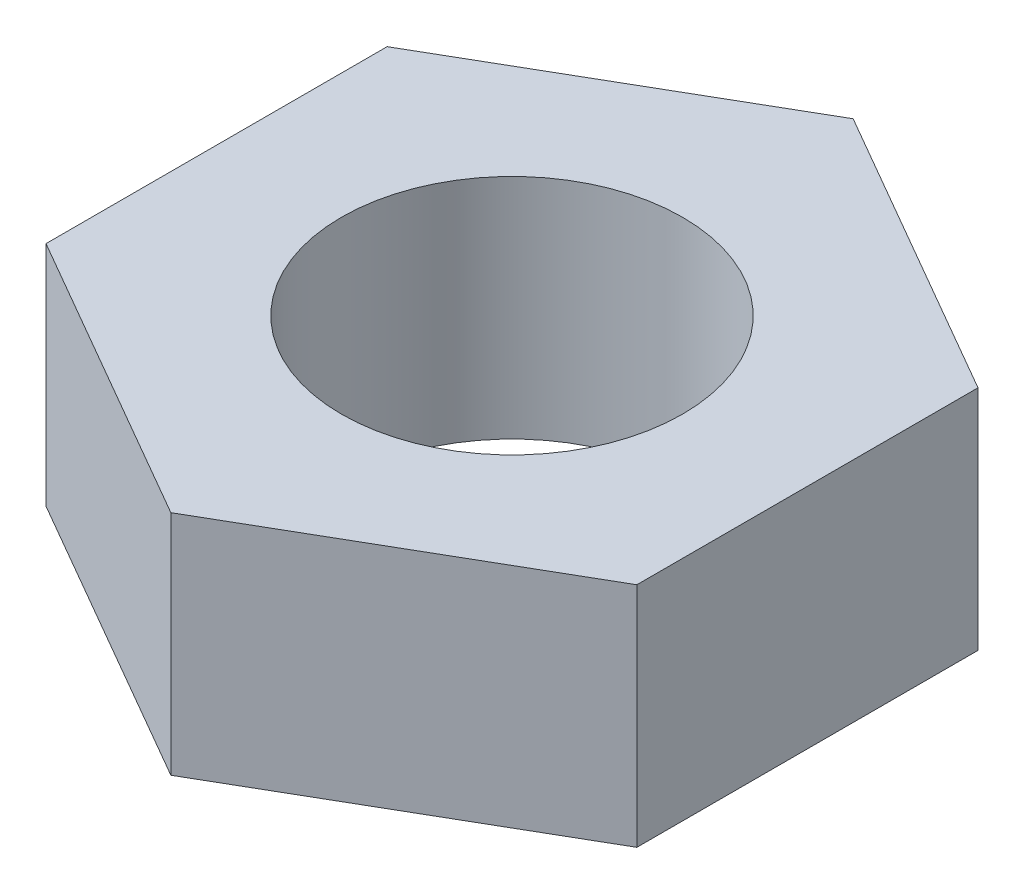
ISO-10303-21;
HEADER;
FILE_DESCRIPTION(('STEP AP214'),'2;1');
FILE_NAME('part.step','',(''),(''),'','','');
FILE_SCHEMA(('AUTOMOTIVE_DESIGN { 1 0 10303 214 1 1 1 1 }'));
ENDSEC;
DATA;
#1=APPLICATION_CONTEXT('core data for automotive mechanical design processes');
#2=APPLICATION_PROTOCOL_DEFINITION('international standard','automotive_design',2000,#1);
#3=PRODUCT_CONTEXT('',#1,'mechanical');
#4=PRODUCT('Part','Part','',(#3));
#5=PRODUCT_RELATED_PRODUCT_CATEGORY('part','',(#4));
#6=PRODUCT_DEFINITION_FORMATION('','',#4);
#7=PRODUCT_DEFINITION_CONTEXT('part definition',#1,'design');
#8=PRODUCT_DEFINITION('design','',#6,#7);
#9=PRODUCT_DEFINITION_SHAPE('','',#8);
#10=(LENGTH_UNIT() NAMED_UNIT(*) SI_UNIT(.MILLI.,.METRE.));
#11=(NAMED_UNIT(*) PLANE_ANGLE_UNIT() SI_UNIT($,.RADIAN.));
#12=(NAMED_UNIT(*) SI_UNIT($,.STERADIAN.) SOLID_ANGLE_UNIT());
#13=UNCERTAINTY_MEASURE_WITH_UNIT(LENGTH_MEASURE(1.E-05),#10,'distance_accuracy_value','');
#14=(GEOMETRIC_REPRESENTATION_CONTEXT(3) GLOBAL_UNCERTAINTY_ASSIGNED_CONTEXT((#13)) GLOBAL_UNIT_ASSIGNED_CONTEXT((#10,
#11,#12)) REPRESENTATION_CONTEXT('',''));
#15=CARTESIAN_POINT('',(0.,0.,0.));
#16=DIRECTION('',(0.,0.,1.));
#17=DIRECTION('',(1.,0.,0.));
#18=AXIS2_PLACEMENT_3D('',#15,#16,#17);
#19=CARTESIAN_POINT('',(-2.59807621135332,2.,-1.49999999999999));
#20=DIRECTION('',(1.,0.,0.));
#21=DIRECTION('',(0.,0.,-1.));
#22=AXIS2_PLACEMENT_3D('',#19,#20,#21);
#23=PLANE('',#22);
#24=DIRECTION('',(0.,0.,1.));
#25=VECTOR('',#24,1.);
#26=CARTESIAN_POINT('',(-2.59807621135332,0.,-1.49999999999999));
#27=LINE('',#26,#25);
#28=CARTESIAN_POINT('',(-2.59807621135332,0.,-1.49999999999999));
#29=VERTEX_POINT('',#28);
#30=CARTESIAN_POINT('',(-2.59807621135332,0.,1.49999999999999));
#31=VERTEX_POINT('',#30);
#32=EDGE_CURVE('E119',#29,#31,#27,.T.);
#33=ORIENTED_EDGE('',*,*,#32,.T.);
#34=DIRECTION('',(0.,-1.,0.));
#35=VECTOR('',#34,1.);
#36=CARTESIAN_POINT('',(-2.59807621135332,2.,1.49999999999999));
#37=LINE('',#36,#35);
#38=CARTESIAN_POINT('',(-2.59807621135332,2.,1.49999999999999));
#39=VERTEX_POINT('',#38);
#40=EDGE_CURVE('E11',#39,#31,#37,.T.);
#41=ORIENTED_EDGE('',*,*,#40,.F.);
#42=DIRECTION('',(0.,0.,1.));
#43=VECTOR('',#42,1.);
#44=CARTESIAN_POINT('',(-2.59807621135332,2.,-1.49999999999999));
#45=LINE('',#44,#43);
#46=CARTESIAN_POINT('',(-2.59807621135332,2.,-1.49999999999999));
#47=VERTEX_POINT('',#46);
#48=EDGE_CURVE('E129',#47,#39,#45,.T.);
#49=ORIENTED_EDGE('',*,*,#48,.F.);
#50=DIRECTION('',(0.,-1.,0.));
#51=VECTOR('',#50,1.);
#52=CARTESIAN_POINT('',(-2.59807621135332,2.,-1.49999999999999));
#53=LINE('',#52,#51);
#54=EDGE_CURVE('E115',#47,#29,#53,.T.);
#55=ORIENTED_EDGE('',*,*,#54,.T.);
#56=EDGE_LOOP('',(#33,#41,#49,#55));
#57=FACE_BOUND('',#56,.T.);
#58=ADVANCED_FACE('F34',(#57),#23,.F.);
#59=CARTESIAN_POINT('',(-2.59807621135332,2.,1.49999999999999));
#60=DIRECTION('',(0.500000000000001,0.,-0.866025403784438));
#61=DIRECTION('',(-0.866025403784438,0.,-0.500000000000001));
#62=AXIS2_PLACEMENT_3D('',#59,#60,#61);
#63=PLANE('',#62);
#64=DIRECTION('',(0.866025403784438,0.,0.500000000000001));
#65=VECTOR('',#64,1.);
#66=CARTESIAN_POINT('',(-2.59807621135332,0.,1.49999999999999));
#67=LINE('',#66,#65);
#68=CARTESIAN_POINT('',(0.,0.,3.));
#69=VERTEX_POINT('',#68);
#70=EDGE_CURVE('E122',#31,#69,#67,.T.);
#71=ORIENTED_EDGE('',*,*,#70,.T.);
#72=DIRECTION('',(0.,-1.,0.));
#73=VECTOR('',#72,1.);
#74=CARTESIAN_POINT('',(0.,2.,3.));
#75=LINE('',#74,#73);
#76=CARTESIAN_POINT('',(0.,2.,3.));
#77=VERTEX_POINT('',#76);
#78=EDGE_CURVE('E43',#77,#69,#75,.T.);
#79=ORIENTED_EDGE('',*,*,#78,.F.);
#80=DIRECTION('',(0.866025403784438,0.,0.500000000000001));
#81=VECTOR('',#80,1.);
#82=CARTESIAN_POINT('',(-2.59807621135332,2.,1.49999999999999));
#83=LINE('',#82,#81);
#84=EDGE_CURVE('E88',#39,#77,#83,.T.);
#85=ORIENTED_EDGE('',*,*,#84,.F.);
#86=ORIENTED_EDGE('',*,*,#40,.T.);
#87=EDGE_LOOP('',(#71,#79,#85,#86));
#88=FACE_BOUND('',#87,.T.);
#89=ADVANCED_FACE('F155',(#88),#63,.F.);
#90=CARTESIAN_POINT('',(0.,2.,3.));
#91=DIRECTION('',(-0.500000000000001,0.,-0.866025403784438));
#92=DIRECTION('',(-0.866025403784438,0.,0.500000000000001));
#93=AXIS2_PLACEMENT_3D('',#90,#91,#92);
#94=PLANE('',#93);
#95=DIRECTION('',(0.866025403784438,0.,-0.500000000000001));
#96=VECTOR('',#95,1.);
#97=CARTESIAN_POINT('',(0.,0.,3.));
#98=LINE('',#97,#96);
#99=CARTESIAN_POINT('',(2.59807621135332,0.,1.49999999999999));
#100=VERTEX_POINT('',#99);
#101=EDGE_CURVE('E124',#69,#100,#98,.T.);
#102=ORIENTED_EDGE('',*,*,#101,.T.);
#103=DIRECTION('',(0.,-1.,0.));
#104=VECTOR('',#103,1.);
#105=CARTESIAN_POINT('',(2.59807621135332,2.,1.49999999999999));
#106=LINE('',#105,#104);
#107=CARTESIAN_POINT('',(2.59807621135332,2.,1.49999999999999));
#108=VERTEX_POINT('',#107);
#109=EDGE_CURVE('E110',#108,#100,#106,.T.);
#110=ORIENTED_EDGE('',*,*,#109,.F.);
#111=DIRECTION('',(0.866025403784438,0.,-0.500000000000001));
#112=VECTOR('',#111,1.);
#113=CARTESIAN_POINT('',(0.,2.,3.));
#114=LINE('',#113,#112);
#115=EDGE_CURVE('E101',#77,#108,#114,.T.);
#116=ORIENTED_EDGE('',*,*,#115,.F.);
#117=ORIENTED_EDGE('',*,*,#78,.T.);
#118=EDGE_LOOP('',(#102,#110,#116,#117));
#119=FACE_BOUND('',#118,.T.);
#120=ADVANCED_FACE('F136',(#119),#94,.F.);
#121=CARTESIAN_POINT('',(2.59807621135332,2.,1.49999999999999));
#122=DIRECTION('',(-1.,0.,0.));
#123=DIRECTION('',(0.,0.,1.));
#124=AXIS2_PLACEMENT_3D('',#121,#122,#123);
#125=PLANE('',#124);
#126=DIRECTION('',(0.,0.,-1.));
#127=VECTOR('',#126,1.);
#128=CARTESIAN_POINT('',(2.59807621135332,0.,1.49999999999999));
#129=LINE('',#128,#127);
#130=CARTESIAN_POINT('',(2.59807621135332,0.,-1.49999999999999));
#131=VERTEX_POINT('',#130);
#132=EDGE_CURVE('E109',#100,#131,#129,.T.);
#133=ORIENTED_EDGE('',*,*,#132,.T.);
#134=DIRECTION('',(0.,-1.,0.));
#135=VECTOR('',#134,1.);
#136=CARTESIAN_POINT('',(2.59807621135332,2.,-1.49999999999999));
#137=LINE('',#136,#135);
#138=CARTESIAN_POINT('',(2.59807621135332,2.,-1.49999999999999));
#139=VERTEX_POINT('',#138);
#140=EDGE_CURVE('E106',#139,#131,#137,.T.);
#141=ORIENTED_EDGE('',*,*,#140,.F.);
#142=DIRECTION('',(0.,0.,-1.));
#143=VECTOR('',#142,1.);
#144=CARTESIAN_POINT('',(2.59807621135332,2.,1.49999999999999));
#145=LINE('',#144,#143);
#146=EDGE_CURVE('E95',#108,#139,#145,.T.);
#147=ORIENTED_EDGE('',*,*,#146,.F.);
#148=ORIENTED_EDGE('',*,*,#109,.T.);
#149=EDGE_LOOP('',(#133,#141,#147,#148));
#150=FACE_BOUND('',#149,.T.);
#151=ADVANCED_FACE('F107',(#150),#125,.F.);
#152=CARTESIAN_POINT('',(2.59807621135332,2.,-1.49999999999999));
#153=DIRECTION('',(-0.500000000000001,0.,0.866025403784438));
#154=DIRECTION('',(0.866025403784438,0.,0.500000000000001));
#155=AXIS2_PLACEMENT_3D('',#152,#153,#154);
#156=PLANE('',#155);
#157=DIRECTION('',(-0.866025403784438,0.,-0.500000000000001));
#158=VECTOR('',#157,1.);
#159=CARTESIAN_POINT('',(2.59807621135332,0.,-1.49999999999999));
#160=LINE('',#159,#158);
#161=CARTESIAN_POINT('',(0.,0.,-3.));
#162=VERTEX_POINT('',#161);
#163=EDGE_CURVE('E74',#131,#162,#160,.T.);
#164=ORIENTED_EDGE('',*,*,#163,.T.);
#165=DIRECTION('',(0.,-1.,0.));
#166=VECTOR('',#165,1.);
#167=CARTESIAN_POINT('',(0.,2.,-3.));
#168=LINE('',#167,#166);
#169=CARTESIAN_POINT('',(0.,2.,-3.));
#170=VERTEX_POINT('',#169);
#171=EDGE_CURVE('E111',#170,#162,#168,.T.);
#172=ORIENTED_EDGE('',*,*,#171,.F.);
#173=DIRECTION('',(-0.866025403784438,0.,-0.500000000000001));
#174=VECTOR('',#173,1.);
#175=CARTESIAN_POINT('',(2.59807621135332,2.,-1.49999999999999));
#176=LINE('',#175,#174);
#177=EDGE_CURVE('E99',#139,#170,#176,.T.);
#178=ORIENTED_EDGE('',*,*,#177,.F.);
#179=ORIENTED_EDGE('',*,*,#140,.T.);
#180=EDGE_LOOP('',(#164,#172,#178,#179));
#181=FACE_BOUND('',#180,.T.);
#182=ADVANCED_FACE('F113',(#181),#156,.F.);
#183=CARTESIAN_POINT('',(0.,2.,-3.));
#184=DIRECTION('',(0.500000000000001,0.,0.866025403784438));
#185=DIRECTION('',(0.866025403784438,0.,-0.500000000000001));
#186=AXIS2_PLACEMENT_3D('',#183,#184,#185);
#187=PLANE('',#186);
#188=DIRECTION('',(-0.866025403784438,0.,0.500000000000001));
#189=VECTOR('',#188,1.);
#190=CARTESIAN_POINT('',(0.,0.,-3.));
#191=LINE('',#190,#189);
#192=EDGE_CURVE('E80',#162,#29,#191,.T.);
#193=ORIENTED_EDGE('',*,*,#192,.T.);
#194=ORIENTED_EDGE('',*,*,#54,.F.);
#195=DIRECTION('',(-0.866025403784438,0.,0.500000000000001));
#196=VECTOR('',#195,1.);
#197=CARTESIAN_POINT('',(0.,2.,-3.));
#198=LINE('',#197,#196);
#199=EDGE_CURVE('E51',#170,#47,#198,.T.);
#200=ORIENTED_EDGE('',*,*,#199,.F.);
#201=ORIENTED_EDGE('',*,*,#171,.T.);
#202=EDGE_LOOP('',(#193,#194,#200,#201));
#203=FACE_BOUND('',#202,.T.);
#204=ADVANCED_FACE('F143',(#203),#187,.F.);
#205=CARTESIAN_POINT('',(0.,2.,0.));
#206=DIRECTION('',(0.,1.,0.));
#207=DIRECTION('',(0.,0.,1.));
#208=AXIS2_PLACEMENT_3D('',#205,#206,#207);
#209=PLANE('',#208);
#210=CARTESIAN_POINT('',(0.,2.,0.));
#211=DIRECTION('',(0.,1.,0.));
#212=DIRECTION('',(0.,0.,1.));
#213=AXIS2_PLACEMENT_3D('',#210,#211,#212);
#214=CIRCLE('',#213,1.5);
#215=CARTESIAN_POINT('',(0.,2.,1.5));
#216=VERTEX_POINT('',#215);
#217=EDGE_CURVE('E222',#216,#216,#214,.T.);
#218=ORIENTED_EDGE('',*,*,#217,.F.);
#219=EDGE_LOOP('',(#218));
#220=FACE_BOUND('',#219,.T.);
#221=ORIENTED_EDGE('',*,*,#48,.T.);
#222=ORIENTED_EDGE('',*,*,#84,.T.);
#223=ORIENTED_EDGE('',*,*,#115,.T.);
#224=ORIENTED_EDGE('',*,*,#146,.T.);
#225=ORIENTED_EDGE('',*,*,#177,.T.);
#226=ORIENTED_EDGE('',*,*,#199,.T.);
#227=EDGE_LOOP('',(#221,#222,#223,#224,#225,#226));
#228=FACE_BOUND('',#227,.T.);
#229=ADVANCED_FACE('F97',(#220,#228),#209,.T.);
#230=CARTESIAN_POINT('',(0.,0.,0.));
#231=DIRECTION('',(0.,1.,0.));
#232=DIRECTION('',(0.,0.,1.));
#233=AXIS2_PLACEMENT_3D('',#230,#231,#232);
#234=PLANE('',#233);
#235=CARTESIAN_POINT('',(0.,0.,0.));
#236=DIRECTION('',(0.,1.,0.));
#237=DIRECTION('',(0.,0.,1.));
#238=AXIS2_PLACEMENT_3D('',#235,#236,#237);
#239=CIRCLE('',#238,1.5);
#240=CARTESIAN_POINT('',(0.,0.,1.5));
#241=VERTEX_POINT('',#240);
#242=EDGE_CURVE('E37',#241,#241,#239,.T.);
#243=ORIENTED_EDGE('',*,*,#242,.T.);
#244=EDGE_LOOP('',(#243));
#245=FACE_BOUND('',#244,.T.);
#246=ORIENTED_EDGE('',*,*,#32,.F.);
#247=ORIENTED_EDGE('',*,*,#192,.F.);
#248=ORIENTED_EDGE('',*,*,#163,.F.);
#249=ORIENTED_EDGE('',*,*,#132,.F.);
#250=ORIENTED_EDGE('',*,*,#101,.F.);
#251=ORIENTED_EDGE('',*,*,#70,.F.);
#252=EDGE_LOOP('',(#246,#247,#248,#249,#250,#251));
#253=FACE_BOUND('',#252,.T.);
#254=ADVANCED_FACE('F139',(#245,#253),#234,.F.);
#255=CARTESIAN_POINT('',(0.,-4.,0.));
#256=DIRECTION('',(0.,1.,0.));
#257=DIRECTION('',(0.,0.,1.));
#258=AXIS2_PLACEMENT_3D('',#255,#256,#257);
#259=CYLINDRICAL_SURFACE('',#258,1.5);
#260=ORIENTED_EDGE('',*,*,#217,.T.);
#261=EDGE_LOOP('',(#260));
#262=FACE_BOUND('',#261,.T.);
#263=ORIENTED_EDGE('',*,*,#242,.F.);
#264=EDGE_LOOP('',(#263));
#265=FACE_BOUND('',#264,.T.);
#266=ADVANCED_FACE('F206',(#262,#265),#259,.F.);
#267=CLOSED_SHELL('',(#58,#89,#120,#151,#182,#204,#229,#254,#266));
#268=MANIFOLD_SOLID_BREP('B2',#267);
#269=ADVANCED_BREP_SHAPE_REPRESENTATION('',(#18,#268),#14);
#270=SHAPE_DEFINITION_REPRESENTATION(#9,#269);
ENDSEC;
END-ISO-10303-21;
